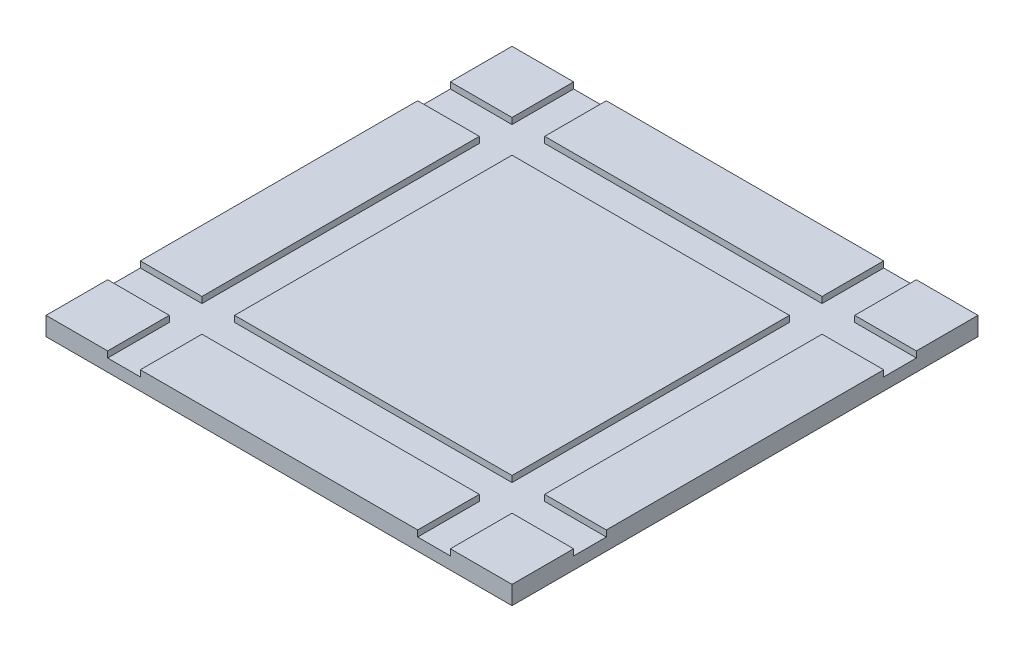
ISO-10303-21;
HEADER;
FILE_DESCRIPTION(('STEP AP214'),'2;1');
FILE_NAME('part.step','',(''),(''),'','','');
FILE_SCHEMA(('AUTOMOTIVE_DESIGN { 1 0 10303 214 1 1 1 1 }'));
ENDSEC;
DATA;
#1=APPLICATION_CONTEXT('core data for automotive mechanical design processes');
#2=APPLICATION_PROTOCOL_DEFINITION('international standard','automotive_design',2000,#1);
#3=PRODUCT_CONTEXT('',#1,'mechanical');
#4=PRODUCT('Part','Part','',(#3));
#5=PRODUCT_RELATED_PRODUCT_CATEGORY('part','',(#4));
#6=PRODUCT_DEFINITION_FORMATION('','',#4);
#7=PRODUCT_DEFINITION_CONTEXT('part definition',#1,'design');
#8=PRODUCT_DEFINITION('design','',#6,#7);
#9=PRODUCT_DEFINITION_SHAPE('','',#8);
#10=(LENGTH_UNIT() NAMED_UNIT(*) SI_UNIT(.MILLI.,.METRE.));
#11=(NAMED_UNIT(*) PLANE_ANGLE_UNIT() SI_UNIT($,.RADIAN.));
#12=(NAMED_UNIT(*) SI_UNIT($,.STERADIAN.) SOLID_ANGLE_UNIT());
#13=UNCERTAINTY_MEASURE_WITH_UNIT(LENGTH_MEASURE(1.E-05),#10,'distance_accuracy_value','');
#14=(GEOMETRIC_REPRESENTATION_CONTEXT(3) GLOBAL_UNCERTAINTY_ASSIGNED_CONTEXT((#13)) GLOBAL_UNIT_ASSIGNED_CONTEXT((#10,
#11,#12)) REPRESENTATION_CONTEXT('',''));
#15=CARTESIAN_POINT('',(0.,0.,0.));
#16=DIRECTION('',(0.,0.,1.));
#17=DIRECTION('',(1.,0.,0.));
#18=AXIS2_PLACEMENT_3D('',#15,#16,#17);
#19=CARTESIAN_POINT('',(0.,0.,0.));
#20=DIRECTION('',(0.,1.,0.));
#21=DIRECTION('',(0.,0.,1.));
#22=AXIS2_PLACEMENT_3D('',#19,#20,#21);
#23=PLANE('',#22);
#24=DIRECTION('',(0.,0.,1.));
#25=VECTOR('',#24,1.);
#26=CARTESIAN_POINT('',(22.5,0.,0.));
#27=LINE('',#26,#25);
#28=CARTESIAN_POINT('',(22.5,0.,-22.5));
#29=VERTEX_POINT('',#28);
#30=CARTESIAN_POINT('',(22.5,0.,22.5));
#31=VERTEX_POINT('',#30);
#32=EDGE_CURVE('E282',#29,#31,#27,.T.);
#33=ORIENTED_EDGE('',*,*,#32,.T.);
#34=DIRECTION('',(1.,0.,0.));
#35=VECTOR('',#34,1.);
#36=CARTESIAN_POINT('',(0.,0.,22.5));
#37=LINE('',#36,#35);
#38=CARTESIAN_POINT('',(-22.5,0.,22.5));
#39=VERTEX_POINT('',#38);
#40=EDGE_CURVE('E298',#39,#31,#37,.T.);
#41=ORIENTED_EDGE('',*,*,#40,.F.);
#42=DIRECTION('',(0.,0.,1.));
#43=VECTOR('',#42,1.);
#44=CARTESIAN_POINT('',(-22.5,0.,0.));
#45=LINE('',#44,#43);
#46=CARTESIAN_POINT('',(-22.5,0.,-22.5));
#47=VERTEX_POINT('',#46);
#48=EDGE_CURVE('E316',#47,#39,#45,.T.);
#49=ORIENTED_EDGE('',*,*,#48,.F.);
#50=DIRECTION('',(1.,0.,0.));
#51=VECTOR('',#50,1.);
#52=CARTESIAN_POINT('',(0.,0.,-22.5));
#53=LINE('',#52,#51);
#54=EDGE_CURVE('E313',#47,#29,#53,.T.);
#55=ORIENTED_EDGE('',*,*,#54,.T.);
#56=EDGE_LOOP('',(#33,#41,#49,#55));
#57=FACE_BOUND('',#56,.T.);
#58=DIRECTION('',(-1.,0.,0.));
#59=VECTOR('',#58,1.);
#60=CARTESIAN_POINT('',(0.,0.,37.8));
#61=LINE('',#60,#59);
#62=CARTESIAN_POINT('',(-22.5,0.,37.8));
#63=VERTEX_POINT('',#62);
#64=CARTESIAN_POINT('',(-27.8,0.,37.8));
#65=VERTEX_POINT('',#64);
#66=EDGE_CURVE('E630',#63,#65,#61,.T.);
#67=ORIENTED_EDGE('',*,*,#66,.F.);
#68=DIRECTION('',(0.,0.,1.));
#69=VECTOR('',#68,1.);
#70=CARTESIAN_POINT('',(-22.4999999999999,0.,0.));
#71=LINE('',#70,#69);
#72=CARTESIAN_POINT('',(-22.5,0.,27.8));
#73=VERTEX_POINT('',#72);
#74=EDGE_CURVE('E65',#73,#63,#71,.T.);
#75=ORIENTED_EDGE('',*,*,#74,.F.);
#76=DIRECTION('',(-1.,0.,0.));
#77=VECTOR('',#76,1.);
#78=CARTESIAN_POINT('',(0.,0.,27.8));
#79=LINE('',#78,#77);
#80=CARTESIAN_POINT('',(22.5,0.,27.8));
#81=VERTEX_POINT('',#80);
#82=EDGE_CURVE('E288',#81,#73,#79,.T.);
#83=ORIENTED_EDGE('',*,*,#82,.F.);
#84=DIRECTION('',(0.,0.,1.));
#85=VECTOR('',#84,1.);
#86=CARTESIAN_POINT('',(22.4999999999999,0.,0.));
#87=LINE('',#86,#85);
#88=CARTESIAN_POINT('',(22.5,0.,37.8));
#89=VERTEX_POINT('',#88);
#90=EDGE_CURVE('E332',#81,#89,#87,.T.);
#91=ORIENTED_EDGE('',*,*,#90,.T.);
#92=CARTESIAN_POINT('',(27.8,0.,37.8));
#93=VERTEX_POINT('',#92);
#94=EDGE_CURVE('E631',#93,#89,#61,.T.);
#95=ORIENTED_EDGE('',*,*,#94,.F.);
#96=DIRECTION('',(0.,0.,1.));
#97=VECTOR('',#96,1.);
#98=CARTESIAN_POINT('',(27.8,0.,0.));
#99=LINE('',#98,#97);
#100=CARTESIAN_POINT('',(27.8,0.,27.8));
#101=VERTEX_POINT('',#100);
#102=EDGE_CURVE('E369',#101,#93,#99,.T.);
#103=ORIENTED_EDGE('',*,*,#102,.F.);
#104=DIRECTION('',(1.,0.,0.));
#105=VECTOR('',#104,1.);
#106=CARTESIAN_POINT('',(0.,0.,27.8));
#107=LINE('',#106,#105);
#108=CARTESIAN_POINT('',(37.8,0.,27.8));
#109=VERTEX_POINT('',#108);
#110=EDGE_CURVE('E363',#101,#109,#107,.T.);
#111=ORIENTED_EDGE('',*,*,#110,.T.);
#112=DIRECTION('',(0.,0.,1.));
#113=VECTOR('',#112,1.);
#114=CARTESIAN_POINT('',(37.7999999999998,0.,-2.96932290076632E-13));
#115=LINE('',#114,#113);
#116=CARTESIAN_POINT('',(37.8,0.,22.5));
#117=VERTEX_POINT('',#116);
#118=EDGE_CURVE('E635',#117,#109,#115,.T.);
#119=ORIENTED_EDGE('',*,*,#118,.F.);
#120=DIRECTION('',(-1.,0.,0.));
#121=VECTOR('',#120,1.);
#122=CARTESIAN_POINT('',(0.,0.,22.4999999999999));
#123=LINE('',#122,#121);
#124=CARTESIAN_POINT('',(27.8,0.,22.5));
#125=VERTEX_POINT('',#124);
#126=EDGE_CURVE('E401',#117,#125,#123,.T.);
#127=ORIENTED_EDGE('',*,*,#126,.T.);
#128=DIRECTION('',(0.,0.,1.));
#129=VECTOR('',#128,1.);
#130=CARTESIAN_POINT('',(27.8,0.,0.));
#131=LINE('',#130,#129);
#132=CARTESIAN_POINT('',(27.8,0.,-22.5));
#133=VERTEX_POINT('',#132);
#134=EDGE_CURVE('E416',#133,#125,#131,.T.);
#135=ORIENTED_EDGE('',*,*,#134,.F.);
#136=DIRECTION('',(-1.,0.,0.));
#137=VECTOR('',#136,1.);
#138=CARTESIAN_POINT('',(0.,0.,-22.4999999999999));
#139=LINE('',#138,#137);
#140=CARTESIAN_POINT('',(37.8,0.,-22.5));
#141=VERTEX_POINT('',#140);
#142=EDGE_CURVE('E395',#141,#133,#139,.T.);
#143=ORIENTED_EDGE('',*,*,#142,.F.);
#144=CARTESIAN_POINT('',(37.7999999999996,0.,-27.8));
#145=VERTEX_POINT('',#144);
#146=EDGE_CURVE('E636',#145,#141,#115,.T.);
#147=ORIENTED_EDGE('',*,*,#146,.F.);
#148=DIRECTION('',(1.,0.,0.));
#149=VECTOR('',#148,1.);
#150=CARTESIAN_POINT('',(0.,0.,-27.8));
#151=LINE('',#150,#149);
#152=CARTESIAN_POINT('',(27.8,0.,-27.8));
#153=VERTEX_POINT('',#152);
#154=EDGE_CURVE('E441',#153,#145,#151,.T.);
#155=ORIENTED_EDGE('',*,*,#154,.F.);
#156=DIRECTION('',(0.,0.,1.));
#157=VECTOR('',#156,1.);
#158=CARTESIAN_POINT('',(27.8,0.,0.));
#159=LINE('',#158,#157);
#160=CARTESIAN_POINT('',(27.8,0.,-37.8));
#161=VERTEX_POINT('',#160);
#162=EDGE_CURVE('E435',#161,#153,#159,.T.);
#163=ORIENTED_EDGE('',*,*,#162,.F.);
#164=DIRECTION('',(1.,0.,0.));
#165=VECTOR('',#164,1.);
#166=CARTESIAN_POINT('',(0.,0.,-37.8));
#167=LINE('',#166,#165);
#168=CARTESIAN_POINT('',(22.5,0.,-37.8));
#169=VERTEX_POINT('',#168);
#170=EDGE_CURVE('E640',#169,#161,#167,.T.);
#171=ORIENTED_EDGE('',*,*,#170,.F.);
#172=DIRECTION('',(0.,0.,-1.));
#173=VECTOR('',#172,1.);
#174=CARTESIAN_POINT('',(22.4999999999999,0.,0.));
#175=LINE('',#174,#173);
#176=CARTESIAN_POINT('',(22.5,0.,-27.8));
#177=VERTEX_POINT('',#176);
#178=EDGE_CURVE('E487',#177,#169,#175,.T.);
#179=ORIENTED_EDGE('',*,*,#178,.F.);
#180=DIRECTION('',(1.,0.,0.));
#181=VECTOR('',#180,1.);
#182=CARTESIAN_POINT('',(0.,0.,-27.8));
#183=LINE('',#182,#181);
#184=CARTESIAN_POINT('',(-22.5,0.,-27.8));
#185=VERTEX_POINT('',#184);
#186=EDGE_CURVE('E466',#185,#177,#183,.T.);
#187=ORIENTED_EDGE('',*,*,#186,.F.);
#188=DIRECTION('',(0.,0.,-1.));
#189=VECTOR('',#188,1.);
#190=CARTESIAN_POINT('',(-22.4999999999999,0.,0.));
#191=LINE('',#190,#189);
#192=CARTESIAN_POINT('',(-22.5,0.,-37.8));
#193=VERTEX_POINT('',#192);
#194=EDGE_CURVE('E472',#185,#193,#191,.T.);
#195=ORIENTED_EDGE('',*,*,#194,.T.);
#196=CARTESIAN_POINT('',(-27.8,0.,-37.7999999999999));
#197=VERTEX_POINT('',#196);
#198=EDGE_CURVE('E617',#197,#193,#167,.T.);
#199=ORIENTED_EDGE('',*,*,#198,.F.);
#200=DIRECTION('',(0.,0.,1.));
#201=VECTOR('',#200,1.);
#202=CARTESIAN_POINT('',(-27.8,0.,0.));
#203=LINE('',#202,#201);
#204=CARTESIAN_POINT('',(-27.8,0.,-27.8));
#205=VERTEX_POINT('',#204);
#206=EDGE_CURVE('E505',#197,#205,#203,.T.);
#207=ORIENTED_EDGE('',*,*,#206,.T.);
#208=DIRECTION('',(1.,0.,0.));
#209=VECTOR('',#208,1.);
#210=CARTESIAN_POINT('',(0.,0.,-27.8));
#211=LINE('',#210,#209);
#212=CARTESIAN_POINT('',(-37.8,0.,-27.8));
#213=VERTEX_POINT('',#212);
#214=EDGE_CURVE('E511',#213,#205,#211,.T.);
#215=ORIENTED_EDGE('',*,*,#214,.F.);
#216=DIRECTION('',(0.,0.,-1.));
#217=VECTOR('',#216,1.);
#218=CARTESIAN_POINT('',(-37.7999999999999,0.,-1.97954860051088E-13));
#219=LINE('',#218,#217);
#220=CARTESIAN_POINT('',(-37.7999999999998,0.,-22.5));
#221=VERTEX_POINT('',#220);
#222=EDGE_CURVE('E611',#221,#213,#219,.T.);
#223=ORIENTED_EDGE('',*,*,#222,.F.);
#224=DIRECTION('',(1.,0.,0.));
#225=VECTOR('',#224,1.);
#226=CARTESIAN_POINT('',(0.,0.,-22.5));
#227=LINE('',#226,#225);
#228=CARTESIAN_POINT('',(-27.8,0.,-22.5));
#229=VERTEX_POINT('',#228);
#230=EDGE_CURVE('E543',#221,#229,#227,.T.);
#231=ORIENTED_EDGE('',*,*,#230,.T.);
#232=DIRECTION('',(0.,0.,-1.));
#233=VECTOR('',#232,1.);
#234=CARTESIAN_POINT('',(-27.8,0.,0.));
#235=LINE('',#234,#233);
#236=CARTESIAN_POINT('',(-27.8,0.,22.5));
#237=VERTEX_POINT('',#236);
#238=EDGE_CURVE('E558',#237,#229,#235,.T.);
#239=ORIENTED_EDGE('',*,*,#238,.F.);
#240=DIRECTION('',(1.,0.,0.));
#241=VECTOR('',#240,1.);
#242=CARTESIAN_POINT('',(0.,0.,22.5));
#243=LINE('',#242,#241);
#244=CARTESIAN_POINT('',(-37.8,0.,22.5));
#245=VERTEX_POINT('',#244);
#246=EDGE_CURVE('E537',#245,#237,#243,.T.);
#247=ORIENTED_EDGE('',*,*,#246,.F.);
#248=CARTESIAN_POINT('',(-37.8,0.,27.8));
#249=VERTEX_POINT('',#248);
#250=EDGE_CURVE('E626',#249,#245,#219,.T.);
#251=ORIENTED_EDGE('',*,*,#250,.F.);
#252=DIRECTION('',(-1.,0.,0.));
#253=VECTOR('',#252,1.);
#254=CARTESIAN_POINT('',(0.,0.,27.8));
#255=LINE('',#254,#253);
#256=CARTESIAN_POINT('',(-27.8,0.,27.8));
#257=VERTEX_POINT('',#256);
#258=EDGE_CURVE('E577',#257,#249,#255,.T.);
#259=ORIENTED_EDGE('',*,*,#258,.F.);
#260=DIRECTION('',(0.,0.,1.));
#261=VECTOR('',#260,1.);
#262=CARTESIAN_POINT('',(-27.8,0.,0.));
#263=LINE('',#262,#261);
#264=EDGE_CURVE('E583',#257,#65,#263,.T.);
#265=ORIENTED_EDGE('',*,*,#264,.T.);
#266=EDGE_LOOP('',(#67,#75,#83,#91,#95,#103,#111,#119,#127,#135,#143,#147,#155,#163,#171,#179,
#187,#195,#199,#207,#215,#223,#231,#239,#247,#251,#259,#265));
#267=FACE_BOUND('',#266,.T.);
#268=ADVANCED_FACE('F39',(#57,#267),#23,.T.);
#269=CARTESIAN_POINT('',(-37.7999999999999,-2.,-1.97954860051088E-13));
#270=DIRECTION('',(1.,0.,0.));
#271=DIRECTION('',(0.,0.,-1.));
#272=AXIS2_PLACEMENT_3D('',#269,#270,#271);
#273=PLANE('',#272);
#274=DIRECTION('',(0.,1.,0.));
#275=VECTOR('',#274,1.);
#276=CARTESIAN_POINT('',(-37.8,-2.,37.8));
#277=LINE('',#276,#275);
#278=CARTESIAN_POINT('',(-37.8,-2.,37.8));
#279=VERTEX_POINT('',#278);
#280=CARTESIAN_POINT('',(-37.8,1.,37.8));
#281=VERTEX_POINT('',#280);
#282=EDGE_CURVE('E43',#279,#281,#277,.T.);
#283=ORIENTED_EDGE('',*,*,#282,.T.);
#284=DIRECTION('',(0.,0.,1.));
#285=VECTOR('',#284,1.);
#286=CARTESIAN_POINT('',(-37.8000000000001,1.,0.));
#287=LINE('',#286,#285);
#288=CARTESIAN_POINT('',(-37.8,1.,27.8));
#289=VERTEX_POINT('',#288);
#290=EDGE_CURVE('E582',#289,#281,#287,.T.);
#291=ORIENTED_EDGE('',*,*,#290,.F.);
#292=DIRECTION('',(0.,-1.,0.));
#293=VECTOR('',#292,1.);
#294=CARTESIAN_POINT('',(-37.8,1.,27.8));
#295=LINE('',#294,#293);
#296=EDGE_CURVE('E608',#289,#249,#295,.T.);
#297=ORIENTED_EDGE('',*,*,#296,.T.);
#298=ORIENTED_EDGE('',*,*,#250,.T.);
#299=DIRECTION('',(0.,-1.,0.));
#300=VECTOR('',#299,1.);
#301=CARTESIAN_POINT('',(-37.8,1.,22.5));
#302=LINE('',#301,#300);
#303=CARTESIAN_POINT('',(-37.8,1.,22.5));
#304=VERTEX_POINT('',#303);
#305=EDGE_CURVE('E554',#304,#245,#302,.T.);
#306=ORIENTED_EDGE('',*,*,#305,.F.);
#307=DIRECTION('',(0.,0.,-1.));
#308=VECTOR('',#307,1.);
#309=CARTESIAN_POINT('',(-37.8,1.,0.));
#310=LINE('',#309,#308);
#311=CARTESIAN_POINT('',(-37.8,1.,-22.5));
#312=VERTEX_POINT('',#311);
#313=EDGE_CURVE('E550',#304,#312,#310,.T.);
#314=ORIENTED_EDGE('',*,*,#313,.T.);
#315=DIRECTION('',(0.,-1.,0.));
#316=VECTOR('',#315,1.);
#317=CARTESIAN_POINT('',(-37.8,1.,-22.5));
#318=LINE('',#317,#316);
#319=EDGE_CURVE('E567',#312,#221,#318,.T.);
#320=ORIENTED_EDGE('',*,*,#319,.T.);
#321=ORIENTED_EDGE('',*,*,#222,.T.);
#322=DIRECTION('',(0.,-1.,0.));
#323=VECTOR('',#322,1.);
#324=CARTESIAN_POINT('',(-37.8,1.,-27.8));
#325=LINE('',#324,#323);
#326=CARTESIAN_POINT('',(-37.8,1.,-27.8));
#327=VERTEX_POINT('',#326);
#328=EDGE_CURVE('E530',#327,#213,#325,.T.);
#329=ORIENTED_EDGE('',*,*,#328,.F.);
#330=DIRECTION('',(0.,0.,1.));
#331=VECTOR('',#330,1.);
#332=CARTESIAN_POINT('',(-37.8000000000001,1.,0.));
#333=LINE('',#332,#331);
#334=CARTESIAN_POINT('',(-37.8,1.,-37.8));
#335=VERTEX_POINT('',#334);
#336=EDGE_CURVE('E515',#335,#327,#333,.T.);
#337=ORIENTED_EDGE('',*,*,#336,.F.);
#338=DIRECTION('',(0.,1.,0.));
#339=VECTOR('',#338,1.);
#340=CARTESIAN_POINT('',(-37.8,-2.,-37.8));
#341=LINE('',#340,#339);
#342=CARTESIAN_POINT('',(-37.8,-2.,-37.8));
#343=VERTEX_POINT('',#342);
#344=EDGE_CURVE('E11',#343,#335,#341,.T.);
#345=ORIENTED_EDGE('',*,*,#344,.F.);
#346=DIRECTION('',(0.,0.,-1.));
#347=VECTOR('',#346,1.);
#348=CARTESIAN_POINT('',(-37.7999999999999,-2.,-1.97954860051088E-13));
#349=LINE('',#348,#347);
#350=EDGE_CURVE('E612',#279,#343,#349,.T.);
#351=ORIENTED_EDGE('',*,*,#350,.F.);
#352=EDGE_LOOP('',(#283,#291,#297,#298,#306,#314,#320,#321,#329,#337,#345,#351));
#353=FACE_BOUND('',#352,.T.);
#354=ADVANCED_FACE('F41',(#353),#273,.F.);
#355=CARTESIAN_POINT('',(0.,-2.,-37.8));
#356=DIRECTION('',(0.,0.,1.));
#357=DIRECTION('',(1.,0.,0.));
#358=AXIS2_PLACEMENT_3D('',#355,#356,#357);
#359=PLANE('',#358);
#360=ORIENTED_EDGE('',*,*,#344,.T.);
#361=DIRECTION('',(1.,0.,0.));
#362=VECTOR('',#361,1.);
#363=CARTESIAN_POINT('',(0.,1.,-37.8));
#364=LINE('',#363,#362);
#365=CARTESIAN_POINT('',(-27.8,1.,-37.8));
#366=VERTEX_POINT('',#365);
#367=EDGE_CURVE('E510',#335,#366,#364,.T.);
#368=ORIENTED_EDGE('',*,*,#367,.T.);
#369=DIRECTION('',(0.,-1.,0.));
#370=VECTOR('',#369,1.);
#371=CARTESIAN_POINT('',(-27.8,1.,-37.8));
#372=LINE('',#371,#370);
#373=EDGE_CURVE('E533',#366,#197,#372,.T.);
#374=ORIENTED_EDGE('',*,*,#373,.T.);
#375=ORIENTED_EDGE('',*,*,#198,.T.);
#376=DIRECTION('',(0.,-1.,0.));
#377=VECTOR('',#376,1.);
#378=CARTESIAN_POINT('',(-22.5,1.,-37.8));
#379=LINE('',#378,#377);
#380=CARTESIAN_POINT('',(-22.5,1.,-37.8));
#381=VERTEX_POINT('',#380);
#382=EDGE_CURVE('E495',#381,#193,#379,.T.);
#383=ORIENTED_EDGE('',*,*,#382,.F.);
#384=DIRECTION('',(1.,0.,0.));
#385=VECTOR('',#384,1.);
#386=CARTESIAN_POINT('',(0.,1.,-37.8));
#387=LINE('',#386,#385);
#388=CARTESIAN_POINT('',(22.5,1.,-37.8));
#389=VERTEX_POINT('',#388);
#390=EDGE_CURVE('E475',#381,#389,#387,.T.);
#391=ORIENTED_EDGE('',*,*,#390,.T.);
#392=DIRECTION('',(0.,-1.,0.));
#393=VECTOR('',#392,1.);
#394=CARTESIAN_POINT('',(22.5,1.,-37.8));
#395=LINE('',#394,#393);
#396=EDGE_CURVE('E498',#389,#169,#395,.T.);
#397=ORIENTED_EDGE('',*,*,#396,.T.);
#398=ORIENTED_EDGE('',*,*,#170,.T.);
#399=DIRECTION('',(0.,-1.,0.));
#400=VECTOR('',#399,1.);
#401=CARTESIAN_POINT('',(27.8,1.,-37.8));
#402=LINE('',#401,#400);
#403=CARTESIAN_POINT('',(27.8,1.,-37.8));
#404=VERTEX_POINT('',#403);
#405=EDGE_CURVE('E463',#404,#161,#402,.T.);
#406=ORIENTED_EDGE('',*,*,#405,.F.);
#407=DIRECTION('',(1.,0.,0.));
#408=VECTOR('',#407,1.);
#409=CARTESIAN_POINT('',(0.,1.,-37.8));
#410=LINE('',#409,#408);
#411=CARTESIAN_POINT('',(37.8,1.,-37.8));
#412=VERTEX_POINT('',#411);
#413=EDGE_CURVE('E440',#404,#412,#410,.T.);
#414=ORIENTED_EDGE('',*,*,#413,.T.);
#415=DIRECTION('',(0.,1.,0.));
#416=VECTOR('',#415,1.);
#417=CARTESIAN_POINT('',(37.8,-2.,-37.8));
#418=LINE('',#417,#416);
#419=CARTESIAN_POINT('',(37.8,-2.,-37.8));
#420=VERTEX_POINT('',#419);
#421=EDGE_CURVE('E49',#420,#412,#418,.T.);
#422=ORIENTED_EDGE('',*,*,#421,.F.);
#423=DIRECTION('',(1.,0.,0.));
#424=VECTOR('',#423,1.);
#425=CARTESIAN_POINT('',(0.,-2.,-37.8));
#426=LINE('',#425,#424);
#427=EDGE_CURVE('E623',#343,#420,#426,.T.);
#428=ORIENTED_EDGE('',*,*,#427,.F.);
#429=EDGE_LOOP('',(#360,#368,#374,#375,#383,#391,#397,#398,#406,#414,#422,#428));
#430=FACE_BOUND('',#429,.T.);
#431=ADVANCED_FACE('F697',(#430),#359,.F.);
#432=CARTESIAN_POINT('',(37.7999999999998,-2.,-2.96932290076632E-13));
#433=DIRECTION('',(-1.,0.,0.));
#434=DIRECTION('',(0.,0.,1.));
#435=AXIS2_PLACEMENT_3D('',#432,#433,#434);
#436=PLANE('',#435);
#437=ORIENTED_EDGE('',*,*,#421,.T.);
#438=DIRECTION('',(0.,0.,1.));
#439=VECTOR('',#438,1.);
#440=CARTESIAN_POINT('',(37.8000000000001,1.,-1.04916075827078E-13));
#441=LINE('',#440,#439);
#442=CARTESIAN_POINT('',(37.8,1.,-27.8));
#443=VERTEX_POINT('',#442);
#444=EDGE_CURVE('E436',#412,#443,#441,.T.);
#445=ORIENTED_EDGE('',*,*,#444,.T.);
#446=DIRECTION('',(0.,-1.,0.));
#447=VECTOR('',#446,1.);
#448=CARTESIAN_POINT('',(37.8,1.,-27.8));
#449=LINE('',#448,#447);
#450=EDGE_CURVE('E451',#443,#145,#449,.T.);
#451=ORIENTED_EDGE('',*,*,#450,.T.);
#452=ORIENTED_EDGE('',*,*,#146,.T.);
#453=DIRECTION('',(0.,-1.,0.));
#454=VECTOR('',#453,1.);
#455=CARTESIAN_POINT('',(37.8,1.,-22.5));
#456=LINE('',#455,#454);
#457=CARTESIAN_POINT('',(37.8,1.,-22.5));
#458=VERTEX_POINT('',#457);
#459=EDGE_CURVE('E412',#458,#141,#456,.T.);
#460=ORIENTED_EDGE('',*,*,#459,.F.);
#461=DIRECTION('',(0.,0.,1.));
#462=VECTOR('',#461,1.);
#463=CARTESIAN_POINT('',(37.8,1.,0.));
#464=LINE('',#463,#462);
#465=CARTESIAN_POINT('',(37.8,1.,22.5));
#466=VERTEX_POINT('',#465);
#467=EDGE_CURVE('E408',#458,#466,#464,.T.);
#468=ORIENTED_EDGE('',*,*,#467,.T.);
#469=DIRECTION('',(0.,-1.,0.));
#470=VECTOR('',#469,1.);
#471=CARTESIAN_POINT('',(37.8,1.,22.5));
#472=LINE('',#471,#470);
#473=EDGE_CURVE('E425',#466,#117,#472,.T.);
#474=ORIENTED_EDGE('',*,*,#473,.T.);
#475=ORIENTED_EDGE('',*,*,#118,.T.);
#476=DIRECTION('',(0.,-1.,0.));
#477=VECTOR('',#476,1.);
#478=CARTESIAN_POINT('',(37.8,1.,27.8));
#479=LINE('',#478,#477);
#480=CARTESIAN_POINT('',(37.8,1.,27.8));
#481=VERTEX_POINT('',#480);
#482=EDGE_CURVE('E392',#481,#109,#479,.T.);
#483=ORIENTED_EDGE('',*,*,#482,.F.);
#484=DIRECTION('',(0.,0.,1.));
#485=VECTOR('',#484,1.);
#486=CARTESIAN_POINT('',(37.8000000000001,1.,1.04916075827078E-13));
#487=LINE('',#486,#485);
#488=CARTESIAN_POINT('',(37.8,1.,37.8));
#489=VERTEX_POINT('',#488);
#490=EDGE_CURVE('E364',#481,#489,#487,.T.);
#491=ORIENTED_EDGE('',*,*,#490,.T.);
#492=DIRECTION('',(0.,1.,0.));
#493=VECTOR('',#492,1.);
#494=CARTESIAN_POINT('',(37.8,-2.,37.8));
#495=LINE('',#494,#493);
#496=CARTESIAN_POINT('',(37.8,-2.,37.8));
#497=VERTEX_POINT('',#496);
#498=EDGE_CURVE('E645',#497,#489,#495,.T.);
#499=ORIENTED_EDGE('',*,*,#498,.F.);
#500=DIRECTION('',(0.,0.,1.));
#501=VECTOR('',#500,1.);
#502=CARTESIAN_POINT('',(37.7999999999998,-2.,-2.96932290076632E-13));
#503=LINE('',#502,#501);
#504=EDGE_CURVE('E620',#420,#497,#503,.T.);
#505=ORIENTED_EDGE('',*,*,#504,.F.);
#506=EDGE_LOOP('',(#437,#445,#451,#452,#460,#468,#474,#475,#483,#491,#499,#505));
#507=FACE_BOUND('',#506,.T.);
#508=ADVANCED_FACE('F719',(#507),#436,.F.);
#509=CARTESIAN_POINT('',(0.,-2.,37.8));
#510=DIRECTION('',(0.,0.,-1.));
#511=DIRECTION('',(-1.,0.,0.));
#512=AXIS2_PLACEMENT_3D('',#509,#510,#511);
#513=PLANE('',#512);
#514=ORIENTED_EDGE('',*,*,#498,.T.);
#515=DIRECTION('',(1.,0.,0.));
#516=VECTOR('',#515,1.);
#517=CARTESIAN_POINT('',(0.,1.,37.8));
#518=LINE('',#517,#516);
#519=CARTESIAN_POINT('',(27.8,1.,37.8));
#520=VERTEX_POINT('',#519);
#521=EDGE_CURVE('E376',#520,#489,#518,.T.);
#522=ORIENTED_EDGE('',*,*,#521,.F.);
#523=DIRECTION('',(0.,-1.,0.));
#524=VECTOR('',#523,1.);
#525=CARTESIAN_POINT('',(27.8,1.,37.8));
#526=LINE('',#525,#524);
#527=EDGE_CURVE('E380',#520,#93,#526,.T.);
#528=ORIENTED_EDGE('',*,*,#527,.T.);
#529=ORIENTED_EDGE('',*,*,#94,.T.);
#530=DIRECTION('',(0.,-1.,0.));
#531=VECTOR('',#530,1.);
#532=CARTESIAN_POINT('',(22.5,1.,37.8));
#533=LINE('',#532,#531);
#534=CARTESIAN_POINT('',(22.5,1.,37.8));
#535=VERTEX_POINT('',#534);
#536=EDGE_CURVE('E354',#535,#89,#533,.T.);
#537=ORIENTED_EDGE('',*,*,#536,.F.);
#538=DIRECTION('',(-1.,0.,0.));
#539=VECTOR('',#538,1.);
#540=CARTESIAN_POINT('',(0.,1.,37.8));
#541=LINE('',#540,#539);
#542=CARTESIAN_POINT('',(-22.5,1.,37.8));
#543=VERTEX_POINT('',#542);
#544=EDGE_CURVE('E335',#535,#543,#541,.T.);
#545=ORIENTED_EDGE('',*,*,#544,.T.);
#546=DIRECTION('',(0.,-1.,0.));
#547=VECTOR('',#546,1.);
#548=CARTESIAN_POINT('',(-22.5,1.,37.8));
#549=LINE('',#548,#547);
#550=EDGE_CURVE('E357',#543,#63,#549,.T.);
#551=ORIENTED_EDGE('',*,*,#550,.T.);
#552=ORIENTED_EDGE('',*,*,#66,.T.);
#553=DIRECTION('',(0.,-1.,0.));
#554=VECTOR('',#553,1.);
#555=CARTESIAN_POINT('',(-27.8,1.,37.8));
#556=LINE('',#555,#554);
#557=CARTESIAN_POINT('',(-27.8,1.,37.8));
#558=VERTEX_POINT('',#557);
#559=EDGE_CURVE('E604',#558,#65,#556,.T.);
#560=ORIENTED_EDGE('',*,*,#559,.F.);
#561=DIRECTION('',(-1.,0.,0.));
#562=VECTOR('',#561,1.);
#563=CARTESIAN_POINT('',(0.,1.,37.8));
#564=LINE('',#563,#562);
#565=EDGE_CURVE('E587',#558,#281,#564,.T.);
#566=ORIENTED_EDGE('',*,*,#565,.T.);
#567=ORIENTED_EDGE('',*,*,#282,.F.);
#568=DIRECTION('',(-1.,0.,0.));
#569=VECTOR('',#568,1.);
#570=CARTESIAN_POINT('',(0.,-2.,37.8));
#571=LINE('',#570,#569);
#572=EDGE_CURVE('E616',#497,#279,#571,.T.);
#573=ORIENTED_EDGE('',*,*,#572,.F.);
#574=EDGE_LOOP('',(#514,#522,#528,#529,#537,#545,#551,#552,#560,#566,#567,#573));
#575=FACE_BOUND('',#574,.T.);
#576=ADVANCED_FACE('F662',(#575),#513,.F.);
#577=CARTESIAN_POINT('',(0.,-2.,0.));
#578=DIRECTION('',(0.,1.,0.));
#579=DIRECTION('',(0.,0.,1.));
#580=AXIS2_PLACEMENT_3D('',#577,#578,#579);
#581=PLANE('',#580);
#582=ORIENTED_EDGE('',*,*,#350,.T.);
#583=ORIENTED_EDGE('',*,*,#427,.T.);
#584=ORIENTED_EDGE('',*,*,#504,.T.);
#585=ORIENTED_EDGE('',*,*,#572,.T.);
#586=EDGE_LOOP('',(#582,#583,#584,#585));
#587=FACE_BOUND('',#586,.T.);
#588=ADVANCED_FACE('F721',(#587),#581,.F.);
#589=CARTESIAN_POINT('',(0.,1.,27.8));
#590=DIRECTION('',(0.,0.,1.));
#591=DIRECTION('',(1.,0.,0.));
#592=AXIS2_PLACEMENT_3D('',#589,#590,#591);
#593=PLANE('',#592);
#594=ORIENTED_EDGE('',*,*,#258,.T.);
#595=ORIENTED_EDGE('',*,*,#296,.F.);
#596=DIRECTION('',(-1.,0.,0.));
#597=VECTOR('',#596,1.);
#598=CARTESIAN_POINT('',(0.,1.,27.8));
#599=LINE('',#598,#597);
#600=CARTESIAN_POINT('',(-27.8,1.,27.8));
#601=VERTEX_POINT('',#600);
#602=EDGE_CURVE('E578',#601,#289,#599,.T.);
#603=ORIENTED_EDGE('',*,*,#602,.F.);
#604=DIRECTION('',(0.,-1.,0.));
#605=VECTOR('',#604,1.);
#606=CARTESIAN_POINT('',(-27.8,1.,27.8));
#607=LINE('',#606,#605);
#608=EDGE_CURVE('E595',#601,#257,#607,.T.);
#609=ORIENTED_EDGE('',*,*,#608,.T.);
#610=EDGE_LOOP('',(#594,#595,#603,#609));
#611=FACE_BOUND('',#610,.T.);
#612=ADVANCED_FACE('F672',(#611),#593,.F.);
#613=CARTESIAN_POINT('',(-27.8,1.,0.));
#614=DIRECTION('',(1.,0.,0.));
#615=DIRECTION('',(0.,0.,-1.));
#616=AXIS2_PLACEMENT_3D('',#613,#614,#615);
#617=PLANE('',#616);
#618=ORIENTED_EDGE('',*,*,#264,.F.);
#619=ORIENTED_EDGE('',*,*,#608,.F.);
#620=DIRECTION('',(0.,0.,1.));
#621=VECTOR('',#620,1.);
#622=CARTESIAN_POINT('',(-27.8,1.,0.));
#623=LINE('',#622,#621);
#624=EDGE_CURVE('E591',#601,#558,#623,.T.);
#625=ORIENTED_EDGE('',*,*,#624,.T.);
#626=ORIENTED_EDGE('',*,*,#559,.T.);
#627=EDGE_LOOP('',(#618,#619,#625,#626));
#628=FACE_BOUND('',#627,.T.);
#629=ADVANCED_FACE('F666',(#628),#617,.T.);
#630=CARTESIAN_POINT('',(0.,1.,0.));
#631=DIRECTION('',(0.,1.,0.));
#632=DIRECTION('',(0.,0.,1.));
#633=AXIS2_PLACEMENT_3D('',#630,#631,#632);
#634=PLANE('',#633);
#635=ORIENTED_EDGE('',*,*,#602,.T.);
#636=ORIENTED_EDGE('',*,*,#290,.T.);
#637=ORIENTED_EDGE('',*,*,#565,.F.);
#638=ORIENTED_EDGE('',*,*,#624,.F.);
#639=EDGE_LOOP('',(#635,#636,#637,#638));
#640=FACE_BOUND('',#639,.T.);
#641=ADVANCED_FACE('F658',(#640),#634,.T.);
#642=CARTESIAN_POINT('',(0.,1.,22.5));
#643=DIRECTION('',(0.,0.,-1.));
#644=DIRECTION('',(-1.,0.,0.));
#645=AXIS2_PLACEMENT_3D('',#642,#643,#644);
#646=PLANE('',#645);
#647=ORIENTED_EDGE('',*,*,#246,.T.);
#648=DIRECTION('',(0.,-1.,0.));
#649=VECTOR('',#648,1.);
#650=CARTESIAN_POINT('',(-27.8,1.,22.5));
#651=LINE('',#650,#649);
#652=CARTESIAN_POINT('',(-27.8,1.,22.5));
#653=VERTEX_POINT('',#652);
#654=EDGE_CURVE('E574',#653,#237,#651,.T.);
#655=ORIENTED_EDGE('',*,*,#654,.F.);
#656=DIRECTION('',(1.,0.,0.));
#657=VECTOR('',#656,1.);
#658=CARTESIAN_POINT('',(0.,1.,22.5));
#659=LINE('',#658,#657);
#660=EDGE_CURVE('E538',#304,#653,#659,.T.);
#661=ORIENTED_EDGE('',*,*,#660,.F.);
#662=ORIENTED_EDGE('',*,*,#305,.T.);
#663=EDGE_LOOP('',(#647,#655,#661,#662));
#664=FACE_BOUND('',#663,.T.);
#665=ADVANCED_FACE('F677',(#664),#646,.F.);
#666=CARTESIAN_POINT('',(-27.8,1.,0.));
#667=DIRECTION('',(-1.,0.,0.));
#668=DIRECTION('',(0.,0.,1.));
#669=AXIS2_PLACEMENT_3D('',#666,#667,#668);
#670=PLANE('',#669);
#671=ORIENTED_EDGE('',*,*,#238,.T.);
#672=DIRECTION('',(0.,-1.,0.));
#673=VECTOR('',#672,1.);
#674=CARTESIAN_POINT('',(-27.8,1.,-22.5));
#675=LINE('',#674,#673);
#676=CARTESIAN_POINT('',(-27.8,1.,-22.5));
#677=VERTEX_POINT('',#676);
#678=EDGE_CURVE('E571',#677,#229,#675,.T.);
#679=ORIENTED_EDGE('',*,*,#678,.F.);
#680=DIRECTION('',(0.,0.,-1.));
#681=VECTOR('',#680,1.);
#682=CARTESIAN_POINT('',(-27.8,1.,0.));
#683=LINE('',#682,#681);
#684=EDGE_CURVE('E542',#653,#677,#683,.T.);
#685=ORIENTED_EDGE('',*,*,#684,.F.);
#686=ORIENTED_EDGE('',*,*,#654,.T.);
#687=EDGE_LOOP('',(#671,#679,#685,#686));
#688=FACE_BOUND('',#687,.T.);
#689=ADVANCED_FACE('F781',(#688),#670,.F.);
#690=CARTESIAN_POINT('',(0.,1.,-22.5));
#691=DIRECTION('',(0.,0.,-1.));
#692=DIRECTION('',(-1.,0.,0.));
#693=AXIS2_PLACEMENT_3D('',#690,#691,#692);
#694=PLANE('',#693);
#695=ORIENTED_EDGE('',*,*,#230,.F.);
#696=ORIENTED_EDGE('',*,*,#319,.F.);
#697=DIRECTION('',(1.,0.,0.));
#698=VECTOR('',#697,1.);
#699=CARTESIAN_POINT('',(0.,1.,-22.5));
#700=LINE('',#699,#698);
#701=EDGE_CURVE('E546',#312,#677,#700,.T.);
#702=ORIENTED_EDGE('',*,*,#701,.T.);
#703=ORIENTED_EDGE('',*,*,#678,.T.);
#704=EDGE_LOOP('',(#695,#696,#702,#703));
#705=FACE_BOUND('',#704,.T.);
#706=ADVANCED_FACE('F683',(#705),#694,.T.);
#707=CARTESIAN_POINT('',(0.,1.,0.));
#708=DIRECTION('',(0.,1.,0.));
#709=DIRECTION('',(0.,0.,1.));
#710=AXIS2_PLACEMENT_3D('',#707,#708,#709);
#711=PLANE('',#710);
#712=ORIENTED_EDGE('',*,*,#660,.T.);
#713=ORIENTED_EDGE('',*,*,#684,.T.);
#714=ORIENTED_EDGE('',*,*,#701,.F.);
#715=ORIENTED_EDGE('',*,*,#313,.F.);
#716=EDGE_LOOP('',(#712,#713,#714,#715));
#717=FACE_BOUND('',#716,.T.);
#718=ADVANCED_FACE('F680',(#717),#711,.T.);
#719=CARTESIAN_POINT('',(-27.8,1.,0.));
#720=DIRECTION('',(1.,0.,0.));
#721=DIRECTION('',(0.,0.,-1.));
#722=AXIS2_PLACEMENT_3D('',#719,#720,#721);
#723=PLANE('',#722);
#724=ORIENTED_EDGE('',*,*,#206,.F.);
#725=ORIENTED_EDGE('',*,*,#373,.F.);
#726=DIRECTION('',(0.,0.,1.));
#727=VECTOR('',#726,1.);
#728=CARTESIAN_POINT('',(-27.8,1.,0.));
#729=LINE('',#728,#727);
#730=CARTESIAN_POINT('',(-27.8,1.,-27.8));
#731=VERTEX_POINT('',#730);
#732=EDGE_CURVE('E506',#366,#731,#729,.T.);
#733=ORIENTED_EDGE('',*,*,#732,.T.);
#734=DIRECTION('',(0.,-1.,0.));
#735=VECTOR('',#734,1.);
#736=CARTESIAN_POINT('',(-27.8,1.,-27.8));
#737=LINE('',#736,#735);
#738=EDGE_CURVE('E521',#731,#205,#737,.T.);
#739=ORIENTED_EDGE('',*,*,#738,.T.);
#740=EDGE_LOOP('',(#724,#725,#733,#739));
#741=FACE_BOUND('',#740,.T.);
#742=ADVANCED_FACE('F731',(#741),#723,.T.);
#743=CARTESIAN_POINT('',(0.,1.,-27.8));
#744=DIRECTION('',(0.,0.,-1.));
#745=DIRECTION('',(-1.,0.,0.));
#746=AXIS2_PLACEMENT_3D('',#743,#744,#745);
#747=PLANE('',#746);
#748=ORIENTED_EDGE('',*,*,#214,.T.);
#749=ORIENTED_EDGE('',*,*,#738,.F.);
#750=DIRECTION('',(1.,0.,0.));
#751=VECTOR('',#750,1.);
#752=CARTESIAN_POINT('',(0.,1.,-27.8));
#753=LINE('',#752,#751);
#754=EDGE_CURVE('E518',#327,#731,#753,.T.);
#755=ORIENTED_EDGE('',*,*,#754,.F.);
#756=ORIENTED_EDGE('',*,*,#328,.T.);
#757=EDGE_LOOP('',(#748,#749,#755,#756));
#758=FACE_BOUND('',#757,.T.);
#759=ADVANCED_FACE('F791',(#758),#747,.F.);
#760=CARTESIAN_POINT('',(0.,1.,0.));
#761=DIRECTION('',(0.,1.,0.));
#762=DIRECTION('',(0.,0.,1.));
#763=AXIS2_PLACEMENT_3D('',#760,#761,#762);
#764=PLANE('',#763);
#765=ORIENTED_EDGE('',*,*,#732,.F.);
#766=ORIENTED_EDGE('',*,*,#367,.F.);
#767=ORIENTED_EDGE('',*,*,#336,.T.);
#768=ORIENTED_EDGE('',*,*,#754,.T.);
#769=EDGE_LOOP('',(#765,#766,#767,#768));
#770=FACE_BOUND('',#769,.T.);
#771=ADVANCED_FACE('F727',(#770),#764,.T.);
#772=CARTESIAN_POINT('',(0.,1.,-27.8));
#773=DIRECTION('',(0.,0.,-1.));
#774=DIRECTION('',(-1.,0.,0.));
#775=AXIS2_PLACEMENT_3D('',#772,#773,#774);
#776=PLANE('',#775);
#777=ORIENTED_EDGE('',*,*,#186,.T.);
#778=DIRECTION('',(0.,-1.,0.));
#779=VECTOR('',#778,1.);
#780=CARTESIAN_POINT('',(22.5,1.,-27.8));
#781=LINE('',#780,#779);
#782=CARTESIAN_POINT('',(22.5,1.,-27.8));
#783=VERTEX_POINT('',#782);
#784=EDGE_CURVE('E502',#783,#177,#781,.T.);
#785=ORIENTED_EDGE('',*,*,#784,.F.);
#786=DIRECTION('',(1.,0.,0.));
#787=VECTOR('',#786,1.);
#788=CARTESIAN_POINT('',(0.,1.,-27.8));
#789=LINE('',#788,#787);
#790=CARTESIAN_POINT('',(-22.5,1.,-27.8));
#791=VERTEX_POINT('',#790);
#792=EDGE_CURVE('E467',#791,#783,#789,.T.);
#793=ORIENTED_EDGE('',*,*,#792,.F.);
#794=DIRECTION('',(0.,-1.,0.));
#795=VECTOR('',#794,1.);
#796=CARTESIAN_POINT('',(-22.5,1.,-27.8));
#797=LINE('',#796,#795);
#798=EDGE_CURVE('E483',#791,#185,#797,.T.);
#799=ORIENTED_EDGE('',*,*,#798,.T.);
#800=EDGE_LOOP('',(#777,#785,#793,#799));
#801=FACE_BOUND('',#800,.T.);
#802=ADVANCED_FACE('F742',(#801),#776,.F.);
#803=CARTESIAN_POINT('',(22.4999999999999,1.,0.));
#804=DIRECTION('',(-1.,0.,0.));
#805=DIRECTION('',(0.,0.,1.));
#806=AXIS2_PLACEMENT_3D('',#803,#804,#805);
#807=PLANE('',#806);
#808=ORIENTED_EDGE('',*,*,#178,.T.);
#809=ORIENTED_EDGE('',*,*,#396,.F.);
#810=DIRECTION('',(0.,0.,-1.));
#811=VECTOR('',#810,1.);
#812=CARTESIAN_POINT('',(22.4999999999999,1.,0.));
#813=LINE('',#812,#811);
#814=EDGE_CURVE('E471',#783,#389,#813,.T.);
#815=ORIENTED_EDGE('',*,*,#814,.F.);
#816=ORIENTED_EDGE('',*,*,#784,.T.);
#817=EDGE_LOOP('',(#808,#809,#815,#816));
#818=FACE_BOUND('',#817,.T.);
#819=ADVANCED_FACE('F744',(#818),#807,.F.);
#820=CARTESIAN_POINT('',(-22.4999999999999,1.,0.));
#821=DIRECTION('',(-1.,0.,0.));
#822=DIRECTION('',(0.,0.,1.));
#823=AXIS2_PLACEMENT_3D('',#820,#821,#822);
#824=PLANE('',#823);
#825=ORIENTED_EDGE('',*,*,#194,.F.);
#826=ORIENTED_EDGE('',*,*,#798,.F.);
#827=DIRECTION('',(0.,0.,-1.));
#828=VECTOR('',#827,1.);
#829=CARTESIAN_POINT('',(-22.4999999999999,1.,0.));
#830=LINE('',#829,#828);
#831=EDGE_CURVE('E479',#791,#381,#830,.T.);
#832=ORIENTED_EDGE('',*,*,#831,.T.);
#833=ORIENTED_EDGE('',*,*,#382,.T.);
#834=EDGE_LOOP('',(#825,#826,#832,#833));
#835=FACE_BOUND('',#834,.T.);
#836=ADVANCED_FACE('F738',(#835),#824,.T.);
#837=CARTESIAN_POINT('',(0.,1.,0.));
#838=DIRECTION('',(0.,1.,0.));
#839=DIRECTION('',(0.,0.,1.));
#840=AXIS2_PLACEMENT_3D('',#837,#838,#839);
#841=PLANE('',#840);
#842=ORIENTED_EDGE('',*,*,#792,.T.);
#843=ORIENTED_EDGE('',*,*,#814,.T.);
#844=ORIENTED_EDGE('',*,*,#390,.F.);
#845=ORIENTED_EDGE('',*,*,#831,.F.);
#846=EDGE_LOOP('',(#842,#843,#844,#845));
#847=FACE_BOUND('',#846,.T.);
#848=ADVANCED_FACE('F737',(#847),#841,.T.);
#849=CARTESIAN_POINT('',(27.8,1.,0.));
#850=DIRECTION('',(1.,0.,0.));
#851=DIRECTION('',(0.,0.,-1.));
#852=AXIS2_PLACEMENT_3D('',#849,#850,#851);
#853=PLANE('',#852);
#854=ORIENTED_EDGE('',*,*,#162,.T.);
#855=DIRECTION('',(0.,-1.,0.));
#856=VECTOR('',#855,1.);
#857=CARTESIAN_POINT('',(27.8,1.,-27.8));
#858=LINE('',#857,#856);
#859=CARTESIAN_POINT('',(27.8,1.,-27.8));
#860=VERTEX_POINT('',#859);
#861=EDGE_CURVE('E459',#860,#153,#858,.T.);
#862=ORIENTED_EDGE('',*,*,#861,.F.);
#863=DIRECTION('',(0.,0.,1.));
#864=VECTOR('',#863,1.);
#865=CARTESIAN_POINT('',(27.8,1.,0.));
#866=LINE('',#865,#864);
#867=EDGE_CURVE('E445',#404,#860,#866,.T.);
#868=ORIENTED_EDGE('',*,*,#867,.F.);
#869=ORIENTED_EDGE('',*,*,#405,.T.);
#870=EDGE_LOOP('',(#854,#862,#868,#869));
#871=FACE_BOUND('',#870,.T.);
#872=ADVANCED_FACE('F707',(#871),#853,.F.);
#873=CARTESIAN_POINT('',(0.,1.,-27.8));
#874=DIRECTION('',(0.,0.,-1.));
#875=DIRECTION('',(-1.,0.,0.));
#876=AXIS2_PLACEMENT_3D('',#873,#874,#875);
#877=PLANE('',#876);
#878=ORIENTED_EDGE('',*,*,#154,.T.);
#879=ORIENTED_EDGE('',*,*,#450,.F.);
#880=DIRECTION('',(1.,0.,0.));
#881=VECTOR('',#880,1.);
#882=CARTESIAN_POINT('',(0.,1.,-27.8));
#883=LINE('',#882,#881);
#884=EDGE_CURVE('E448',#860,#443,#883,.T.);
#885=ORIENTED_EDGE('',*,*,#884,.F.);
#886=ORIENTED_EDGE('',*,*,#861,.T.);
#887=EDGE_LOOP('',(#878,#879,#885,#886));
#888=FACE_BOUND('',#887,.T.);
#889=ADVANCED_FACE('F710',(#888),#877,.F.);
#890=CARTESIAN_POINT('',(0.,1.,0.));
#891=DIRECTION('',(0.,1.,0.));
#892=DIRECTION('',(0.,0.,1.));
#893=AXIS2_PLACEMENT_3D('',#890,#891,#892);
#894=PLANE('',#893);
#895=ORIENTED_EDGE('',*,*,#444,.F.);
#896=ORIENTED_EDGE('',*,*,#413,.F.);
#897=ORIENTED_EDGE('',*,*,#867,.T.);
#898=ORIENTED_EDGE('',*,*,#884,.T.);
#899=EDGE_LOOP('',(#895,#896,#897,#898));
#900=FACE_BOUND('',#899,.T.);
#901=ADVANCED_FACE('F714',(#900),#894,.T.);
#902=CARTESIAN_POINT('',(0.,1.,-22.4999999999999));
#903=DIRECTION('',(0.,0.,1.));
#904=DIRECTION('',(1.,0.,0.));
#905=AXIS2_PLACEMENT_3D('',#902,#903,#904);
#906=PLANE('',#905);
#907=ORIENTED_EDGE('',*,*,#142,.T.);
#908=DIRECTION('',(0.,-1.,0.));
#909=VECTOR('',#908,1.);
#910=CARTESIAN_POINT('',(27.8,1.,-22.5));
#911=LINE('',#910,#909);
#912=CARTESIAN_POINT('',(27.8,1.,-22.5));
#913=VERTEX_POINT('',#912);
#914=EDGE_CURVE('E432',#913,#133,#911,.T.);
#915=ORIENTED_EDGE('',*,*,#914,.F.);
#916=DIRECTION('',(-1.,0.,0.));
#917=VECTOR('',#916,1.);
#918=CARTESIAN_POINT('',(0.,1.,-22.4999999999999));
#919=LINE('',#918,#917);
#920=EDGE_CURVE('E396',#458,#913,#919,.T.);
#921=ORIENTED_EDGE('',*,*,#920,.F.);
#922=ORIENTED_EDGE('',*,*,#459,.T.);
#923=EDGE_LOOP('',(#907,#915,#921,#922));
#924=FACE_BOUND('',#923,.T.);
#925=ADVANCED_FACE('F847',(#924),#906,.F.);
#926=CARTESIAN_POINT('',(27.8,1.,0.));
#927=DIRECTION('',(1.,0.,0.));
#928=DIRECTION('',(0.,0.,-1.));
#929=AXIS2_PLACEMENT_3D('',#926,#927,#928);
#930=PLANE('',#929);
#931=ORIENTED_EDGE('',*,*,#134,.T.);
#932=DIRECTION('',(0.,-1.,0.));
#933=VECTOR('',#932,1.);
#934=CARTESIAN_POINT('',(27.8,1.,22.5));
#935=LINE('',#934,#933);
#936=CARTESIAN_POINT('',(27.8,1.,22.5));
#937=VERTEX_POINT('',#936);
#938=EDGE_CURVE('E429',#937,#125,#935,.T.);
#939=ORIENTED_EDGE('',*,*,#938,.F.);
#940=DIRECTION('',(0.,0.,1.));
#941=VECTOR('',#940,1.);
#942=CARTESIAN_POINT('',(27.8,1.,0.));
#943=LINE('',#942,#941);
#944=EDGE_CURVE('E400',#913,#937,#943,.T.);
#945=ORIENTED_EDGE('',*,*,#944,.F.);
#946=ORIENTED_EDGE('',*,*,#914,.T.);
#947=EDGE_LOOP('',(#931,#939,#945,#946));
#948=FACE_BOUND('',#947,.T.);
#949=ADVANCED_FACE('F856',(#948),#930,.F.);
#950=CARTESIAN_POINT('',(0.,1.,22.4999999999999));
#951=DIRECTION('',(0.,0.,1.));
#952=DIRECTION('',(1.,0.,0.));
#953=AXIS2_PLACEMENT_3D('',#950,#951,#952);
#954=PLANE('',#953);
#955=ORIENTED_EDGE('',*,*,#126,.F.);
#956=ORIENTED_EDGE('',*,*,#473,.F.);
#957=DIRECTION('',(-1.,0.,0.));
#958=VECTOR('',#957,1.);
#959=CARTESIAN_POINT('',(0.,1.,22.4999999999999));
#960=LINE('',#959,#958);
#961=EDGE_CURVE('E404',#466,#937,#960,.T.);
#962=ORIENTED_EDGE('',*,*,#961,.T.);
#963=ORIENTED_EDGE('',*,*,#938,.T.);
#964=EDGE_LOOP('',(#955,#956,#962,#963));
#965=FACE_BOUND('',#964,.T.);
#966=ADVANCED_FACE('F866',(#965),#954,.T.);
#967=CARTESIAN_POINT('',(0.,1.,0.));
#968=DIRECTION('',(0.,1.,0.));
#969=DIRECTION('',(0.,0.,1.));
#970=AXIS2_PLACEMENT_3D('',#967,#968,#969);
#971=PLANE('',#970);
#972=ORIENTED_EDGE('',*,*,#920,.T.);
#973=ORIENTED_EDGE('',*,*,#944,.T.);
#974=ORIENTED_EDGE('',*,*,#961,.F.);
#975=ORIENTED_EDGE('',*,*,#467,.F.);
#976=EDGE_LOOP('',(#972,#973,#974,#975));
#977=FACE_BOUND('',#976,.T.);
#978=ADVANCED_FACE('F876',(#977),#971,.T.);
#979=CARTESIAN_POINT('',(0.,1.,27.8));
#980=DIRECTION('',(0.,0.,-1.));
#981=DIRECTION('',(-1.,0.,0.));
#982=AXIS2_PLACEMENT_3D('',#979,#980,#981);
#983=PLANE('',#982);
#984=ORIENTED_EDGE('',*,*,#110,.F.);
#985=DIRECTION('',(0.,-1.,0.));
#986=VECTOR('',#985,1.);
#987=CARTESIAN_POINT('',(27.8,1.,27.8));
#988=LINE('',#987,#986);
#989=CARTESIAN_POINT('',(27.8,1.,27.8));
#990=VERTEX_POINT('',#989);
#991=EDGE_CURVE('E389',#990,#101,#988,.T.);
#992=ORIENTED_EDGE('',*,*,#991,.F.);
#993=DIRECTION('',(1.,0.,0.));
#994=VECTOR('',#993,1.);
#995=CARTESIAN_POINT('',(0.,1.,27.8));
#996=LINE('',#995,#994);
#997=EDGE_CURVE('E368',#990,#481,#996,.T.);
#998=ORIENTED_EDGE('',*,*,#997,.T.);
#999=ORIENTED_EDGE('',*,*,#482,.T.);
#1000=EDGE_LOOP('',(#984,#992,#998,#999));
#1001=FACE_BOUND('',#1000,.T.);
#1002=ADVANCED_FACE('F886',(#1001),#983,.T.);
#1003=CARTESIAN_POINT('',(27.8,1.,0.));
#1004=DIRECTION('',(1.,0.,0.));
#1005=DIRECTION('',(0.,0.,-1.));
#1006=AXIS2_PLACEMENT_3D('',#1003,#1004,#1005);
#1007=PLANE('',#1006);
#1008=ORIENTED_EDGE('',*,*,#102,.T.);
#1009=ORIENTED_EDGE('',*,*,#527,.F.);
#1010=DIRECTION('',(0.,0.,1.));
#1011=VECTOR('',#1010,1.);
#1012=CARTESIAN_POINT('',(27.8,1.,0.));
#1013=LINE('',#1012,#1011);
#1014=EDGE_CURVE('E373',#990,#520,#1013,.T.);
#1015=ORIENTED_EDGE('',*,*,#1014,.F.);
#1016=ORIENTED_EDGE('',*,*,#991,.T.);
#1017=EDGE_LOOP('',(#1008,#1009,#1015,#1016));
#1018=FACE_BOUND('',#1017,.T.);
#1019=ADVANCED_FACE('F896',(#1018),#1007,.F.);
#1020=CARTESIAN_POINT('',(0.,1.,0.));
#1021=DIRECTION('',(0.,1.,0.));
#1022=DIRECTION('',(0.,0.,1.));
#1023=AXIS2_PLACEMENT_3D('',#1020,#1021,#1022);
#1024=PLANE('',#1023);
#1025=ORIENTED_EDGE('',*,*,#490,.F.);
#1026=ORIENTED_EDGE('',*,*,#997,.F.);
#1027=ORIENTED_EDGE('',*,*,#1014,.T.);
#1028=ORIENTED_EDGE('',*,*,#521,.T.);
#1029=EDGE_LOOP('',(#1025,#1026,#1027,#1028));
#1030=FACE_BOUND('',#1029,.T.);
#1031=ADVANCED_FACE('F906',(#1030),#1024,.T.);
#1032=CARTESIAN_POINT('',(0.,1.,27.8));
#1033=DIRECTION('',(0.,0.,1.));
#1034=DIRECTION('',(1.,0.,0.));
#1035=AXIS2_PLACEMENT_3D('',#1032,#1033,#1034);
#1036=PLANE('',#1035);
#1037=ORIENTED_EDGE('',*,*,#82,.T.);
#1038=DIRECTION('',(0.,-1.,0.));
#1039=VECTOR('',#1038,1.);
#1040=CARTESIAN_POINT('',(-22.5,1.,27.8));
#1041=LINE('',#1040,#1039);
#1042=CARTESIAN_POINT('',(-22.5,1.,27.8));
#1043=VERTEX_POINT('',#1042);
#1044=EDGE_CURVE('E360',#1043,#73,#1041,.T.);
#1045=ORIENTED_EDGE('',*,*,#1044,.F.);
#1046=DIRECTION('',(-1.,0.,0.));
#1047=VECTOR('',#1046,1.);
#1048=CARTESIAN_POINT('',(0.,1.,27.8));
#1049=LINE('',#1048,#1047);
#1050=CARTESIAN_POINT('',(22.5,1.,27.8));
#1051=VERTEX_POINT('',#1050);
#1052=EDGE_CURVE('E327',#1051,#1043,#1049,.T.);
#1053=ORIENTED_EDGE('',*,*,#1052,.F.);
#1054=DIRECTION('',(0.,-1.,0.));
#1055=VECTOR('',#1054,1.);
#1056=CARTESIAN_POINT('',(22.5,1.,27.8));
#1057=LINE('',#1056,#1055);
#1058=EDGE_CURVE('E343',#1051,#81,#1057,.T.);
#1059=ORIENTED_EDGE('',*,*,#1058,.T.);
#1060=EDGE_LOOP('',(#1037,#1045,#1053,#1059));
#1061=FACE_BOUND('',#1060,.T.);
#1062=ADVANCED_FACE('F916',(#1061),#1036,.F.);
#1063=CARTESIAN_POINT('',(-22.4999999999999,1.,0.));
#1064=DIRECTION('',(1.,0.,0.));
#1065=DIRECTION('',(0.,0.,-1.));
#1066=AXIS2_PLACEMENT_3D('',#1063,#1064,#1065);
#1067=PLANE('',#1066);
#1068=ORIENTED_EDGE('',*,*,#74,.T.);
#1069=ORIENTED_EDGE('',*,*,#550,.F.);
#1070=DIRECTION('',(0.,0.,1.));
#1071=VECTOR('',#1070,1.);
#1072=CARTESIAN_POINT('',(-22.4999999999999,1.,0.));
#1073=LINE('',#1072,#1071);
#1074=EDGE_CURVE('E331',#1043,#543,#1073,.T.);
#1075=ORIENTED_EDGE('',*,*,#1074,.F.);
#1076=ORIENTED_EDGE('',*,*,#1044,.T.);
#1077=EDGE_LOOP('',(#1068,#1069,#1075,#1076));
#1078=FACE_BOUND('',#1077,.T.);
#1079=ADVANCED_FACE('F926',(#1078),#1067,.F.);
#1080=CARTESIAN_POINT('',(22.4999999999999,1.,0.));
#1081=DIRECTION('',(1.,0.,0.));
#1082=DIRECTION('',(0.,0.,-1.));
#1083=AXIS2_PLACEMENT_3D('',#1080,#1081,#1082);
#1084=PLANE('',#1083);
#1085=ORIENTED_EDGE('',*,*,#90,.F.);
#1086=ORIENTED_EDGE('',*,*,#1058,.F.);
#1087=DIRECTION('',(0.,0.,1.));
#1088=VECTOR('',#1087,1.);
#1089=CARTESIAN_POINT('',(22.4999999999999,1.,0.));
#1090=LINE('',#1089,#1088);
#1091=EDGE_CURVE('E339',#1051,#535,#1090,.T.);
#1092=ORIENTED_EDGE('',*,*,#1091,.T.);
#1093=ORIENTED_EDGE('',*,*,#536,.T.);
#1094=EDGE_LOOP('',(#1085,#1086,#1092,#1093));
#1095=FACE_BOUND('',#1094,.T.);
#1096=ADVANCED_FACE('F936',(#1095),#1084,.T.);
#1097=CARTESIAN_POINT('',(0.,1.,0.));
#1098=DIRECTION('',(0.,1.,0.));
#1099=DIRECTION('',(0.,0.,1.));
#1100=AXIS2_PLACEMENT_3D('',#1097,#1098,#1099);
#1101=PLANE('',#1100);
#1102=ORIENTED_EDGE('',*,*,#1052,.T.);
#1103=ORIENTED_EDGE('',*,*,#1074,.T.);
#1104=ORIENTED_EDGE('',*,*,#544,.F.);
#1105=ORIENTED_EDGE('',*,*,#1091,.F.);
#1106=EDGE_LOOP('',(#1102,#1103,#1104,#1105));
#1107=FACE_BOUND('',#1106,.T.);
#1108=ADVANCED_FACE('F945',(#1107),#1101,.T.);
#1109=CARTESIAN_POINT('',(22.5,1.,0.));
#1110=DIRECTION('',(1.,0.,0.));
#1111=DIRECTION('',(0.,0.,-1.));
#1112=AXIS2_PLACEMENT_3D('',#1109,#1110,#1111);
#1113=PLANE('',#1112);
#1114=ORIENTED_EDGE('',*,*,#32,.F.);
#1115=DIRECTION('',(0.,-1.,0.));
#1116=VECTOR('',#1115,1.);
#1117=CARTESIAN_POINT('',(22.5,1.,-22.5));
#1118=LINE('',#1117,#1116);
#1119=CARTESIAN_POINT('',(22.5,1.,-22.5));
#1120=VERTEX_POINT('',#1119);
#1121=EDGE_CURVE('E277',#1120,#29,#1118,.T.);
#1122=ORIENTED_EDGE('',*,*,#1121,.F.);
#1123=DIRECTION('',(0.,0.,1.));
#1124=VECTOR('',#1123,1.);
#1125=CARTESIAN_POINT('',(22.5,1.,0.));
#1126=LINE('',#1125,#1124);
#1127=CARTESIAN_POINT('',(22.5,1.,22.5));
#1128=VERTEX_POINT('',#1127);
#1129=EDGE_CURVE('E280',#1120,#1128,#1126,.T.);
#1130=ORIENTED_EDGE('',*,*,#1129,.T.);
#1131=DIRECTION('',(0.,-1.,0.));
#1132=VECTOR('',#1131,1.);
#1133=CARTESIAN_POINT('',(22.5,1.,22.5));
#1134=LINE('',#1133,#1132);
#1135=EDGE_CURVE('E310',#1128,#31,#1134,.T.);
#1136=ORIENTED_EDGE('',*,*,#1135,.T.);
#1137=EDGE_LOOP('',(#1114,#1122,#1130,#1136));
#1138=FACE_BOUND('',#1137,.T.);
#1139=ADVANCED_FACE('F279',(#1138),#1113,.T.);
#1140=CARTESIAN_POINT('',(0.,1.,-22.5));
#1141=DIRECTION('',(0.,0.,-1.));
#1142=DIRECTION('',(-1.,0.,0.));
#1143=AXIS2_PLACEMENT_3D('',#1140,#1141,#1142);
#1144=PLANE('',#1143);
#1145=ORIENTED_EDGE('',*,*,#54,.F.);
#1146=DIRECTION('',(0.,-1.,0.));
#1147=VECTOR('',#1146,1.);
#1148=CARTESIAN_POINT('',(-22.5,1.,-22.5));
#1149=LINE('',#1148,#1147);
#1150=CARTESIAN_POINT('',(-22.5,1.,-22.5));
#1151=VERTEX_POINT('',#1150);
#1152=EDGE_CURVE('E289',#1151,#47,#1149,.T.);
#1153=ORIENTED_EDGE('',*,*,#1152,.F.);
#1154=DIRECTION('',(1.,0.,0.));
#1155=VECTOR('',#1154,1.);
#1156=CARTESIAN_POINT('',(0.,1.,-22.5));
#1157=LINE('',#1156,#1155);
#1158=EDGE_CURVE('E294',#1151,#1120,#1157,.T.);
#1159=ORIENTED_EDGE('',*,*,#1158,.T.);
#1160=ORIENTED_EDGE('',*,*,#1121,.T.);
#1161=EDGE_LOOP('',(#1145,#1153,#1159,#1160));
#1162=FACE_BOUND('',#1161,.T.);
#1163=ADVANCED_FACE('F300',(#1162),#1144,.T.);
#1164=CARTESIAN_POINT('',(-22.5,1.,0.));
#1165=DIRECTION('',(1.,0.,0.));
#1166=DIRECTION('',(0.,0.,-1.));
#1167=AXIS2_PLACEMENT_3D('',#1164,#1165,#1166);
#1168=PLANE('',#1167);
#1169=ORIENTED_EDGE('',*,*,#48,.T.);
#1170=DIRECTION('',(0.,-1.,0.));
#1171=VECTOR('',#1170,1.);
#1172=CARTESIAN_POINT('',(-22.5,1.,22.5));
#1173=LINE('',#1172,#1171);
#1174=CARTESIAN_POINT('',(-22.5,1.,22.5));
#1175=VERTEX_POINT('',#1174);
#1176=EDGE_CURVE('E57',#1175,#39,#1173,.T.);
#1177=ORIENTED_EDGE('',*,*,#1176,.F.);
#1178=DIRECTION('',(0.,0.,1.));
#1179=VECTOR('',#1178,1.);
#1180=CARTESIAN_POINT('',(-22.5,1.,0.));
#1181=LINE('',#1180,#1179);
#1182=EDGE_CURVE('E303',#1151,#1175,#1181,.T.);
#1183=ORIENTED_EDGE('',*,*,#1182,.F.);
#1184=ORIENTED_EDGE('',*,*,#1152,.T.);
#1185=EDGE_LOOP('',(#1169,#1177,#1183,#1184));
#1186=FACE_BOUND('',#1185,.T.);
#1187=ADVANCED_FACE('F972',(#1186),#1168,.F.);
#1188=CARTESIAN_POINT('',(0.,1.,22.5));
#1189=DIRECTION('',(0.,0.,-1.));
#1190=DIRECTION('',(-1.,0.,0.));
#1191=AXIS2_PLACEMENT_3D('',#1188,#1189,#1190);
#1192=PLANE('',#1191);
#1193=ORIENTED_EDGE('',*,*,#40,.T.);
#1194=ORIENTED_EDGE('',*,*,#1135,.F.);
#1195=DIRECTION('',(1.,0.,0.));
#1196=VECTOR('',#1195,1.);
#1197=CARTESIAN_POINT('',(0.,1.,22.5));
#1198=LINE('',#1197,#1196);
#1199=EDGE_CURVE('E295',#1175,#1128,#1198,.T.);
#1200=ORIENTED_EDGE('',*,*,#1199,.F.);
#1201=ORIENTED_EDGE('',*,*,#1176,.T.);
#1202=EDGE_LOOP('',(#1193,#1194,#1200,#1201));
#1203=FACE_BOUND('',#1202,.T.);
#1204=ADVANCED_FACE('F981',(#1203),#1192,.F.);
#1205=CARTESIAN_POINT('',(0.,1.,0.));
#1206=DIRECTION('',(0.,1.,0.));
#1207=DIRECTION('',(0.,0.,1.));
#1208=AXIS2_PLACEMENT_3D('',#1205,#1206,#1207);
#1209=PLANE('',#1208);
#1210=ORIENTED_EDGE('',*,*,#1129,.F.);
#1211=ORIENTED_EDGE('',*,*,#1158,.F.);
#1212=ORIENTED_EDGE('',*,*,#1182,.T.);
#1213=ORIENTED_EDGE('',*,*,#1199,.T.);
#1214=EDGE_LOOP('',(#1210,#1211,#1212,#1213));
#1215=FACE_BOUND('',#1214,.T.);
#1216=ADVANCED_FACE('F293',(#1215),#1209,.T.);
#1217=CLOSED_SHELL('',(#268,#354,#431,#508,#576,#588,#612,#629,#641,#665,#689,#706,#718,#742,
#759,#771,#802,#819,#836,#848,#872,#889,#901,#925,#949,#966,#978,#1002,#1019,#1031,#1062,#1079,
#1096,#1108,#1139,#1163,#1187,#1204,#1216));
#1218=MANIFOLD_SOLID_BREP('B2',#1217);
#1219=ADVANCED_BREP_SHAPE_REPRESENTATION('',(#18,#1218),#14);
#1220=SHAPE_DEFINITION_REPRESENTATION(#9,#1219);
ENDSEC;
END-ISO-10303-21;
